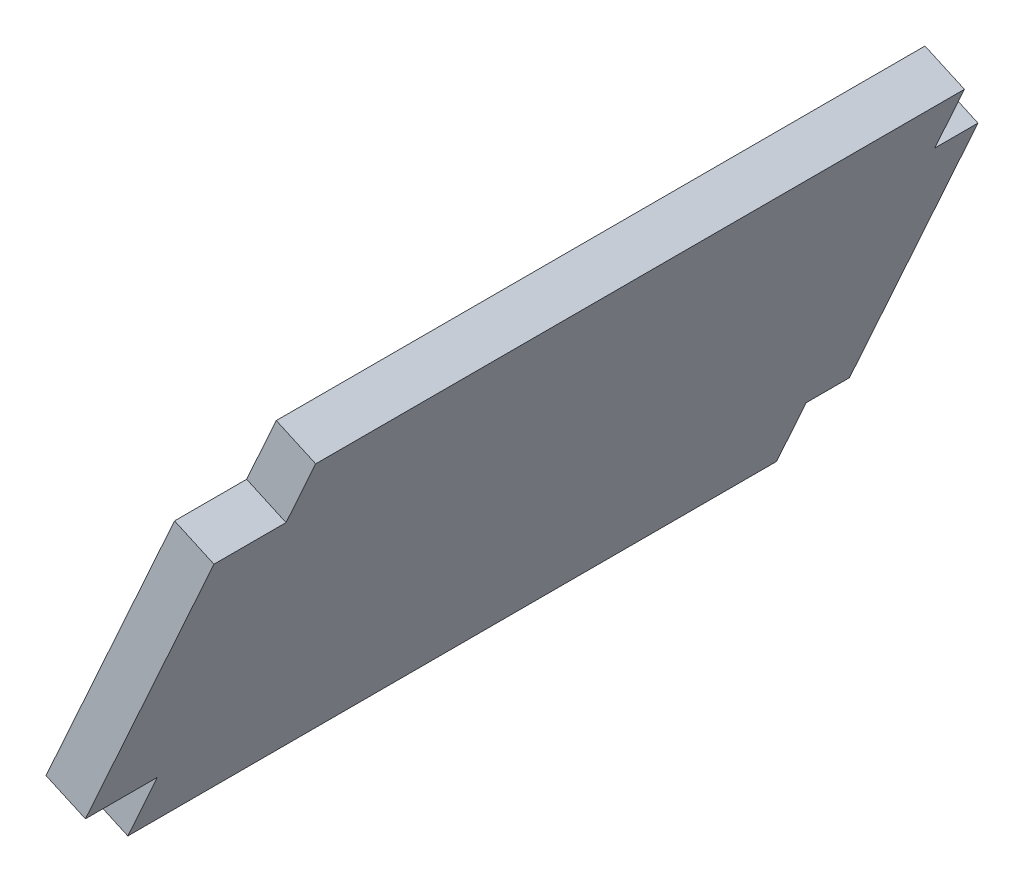
ISO-10303-21;
HEADER;
FILE_DESCRIPTION(('STEP AP214'),'2;1');
FILE_NAME('part.step','',(''),(''),'','','');
FILE_SCHEMA(('AUTOMOTIVE_DESIGN { 1 0 10303 214 1 1 1 1 }'));
ENDSEC;
DATA;
#1=APPLICATION_CONTEXT('core data for automotive mechanical design processes');
#2=APPLICATION_PROTOCOL_DEFINITION('international standard','automotive_design',2000,#1);
#3=PRODUCT_CONTEXT('',#1,'mechanical');
#4=PRODUCT('Part','Part','',(#3));
#5=PRODUCT_RELATED_PRODUCT_CATEGORY('part','',(#4));
#6=PRODUCT_DEFINITION_FORMATION('','',#4);
#7=PRODUCT_DEFINITION_CONTEXT('part definition',#1,'design');
#8=PRODUCT_DEFINITION('design','',#6,#7);
#9=PRODUCT_DEFINITION_SHAPE('','',#8);
#10=(LENGTH_UNIT() NAMED_UNIT(*) SI_UNIT(.MILLI.,.METRE.));
#11=(NAMED_UNIT(*) PLANE_ANGLE_UNIT() SI_UNIT($,.RADIAN.));
#12=(NAMED_UNIT(*) SI_UNIT($,.STERADIAN.) SOLID_ANGLE_UNIT());
#13=UNCERTAINTY_MEASURE_WITH_UNIT(LENGTH_MEASURE(1.E-05),#10,'distance_accuracy_value','');
#14=(GEOMETRIC_REPRESENTATION_CONTEXT(3) GLOBAL_UNCERTAINTY_ASSIGNED_CONTEXT((#13)) GLOBAL_UNIT_ASSIGNED_CONTEXT((#10,
#11,#12)) REPRESENTATION_CONTEXT('',''));
#15=CARTESIAN_POINT('',(0.,0.,0.));
#16=DIRECTION('',(0.,0.,1.));
#17=DIRECTION('',(1.,0.,0.));
#18=AXIS2_PLACEMENT_3D('',#15,#16,#17);
#19=CARTESIAN_POINT('',(210.601374281952,-57.1803626152906,-72.0098796299445));
#20=DIRECTION('',(0.411371375130518,0.911467822648296,0.));
#21=DIRECTION('',(-0.911467822648296,0.411371375130518,0.));
#22=AXIS2_PLACEMENT_3D('',#19,#20,#21);
#23=PLANE('',#22);
#24=DIRECTION('',(0.,0.,1.));
#25=VECTOR('',#24,1.);
#26=CARTESIAN_POINT('',(210.601374281952,-57.1803626152906,-72.0098796299445));
#27=LINE('',#26,#25);
#28=CARTESIAN_POINT('',(210.601374281952,-57.1803626152906,-48.));
#29=VERTEX_POINT('',#28);
#30=CARTESIAN_POINT('',(210.601374281951,-57.1803626152922,-45.));
#31=VERTEX_POINT('',#30);
#32=EDGE_CURVE('E185',#29,#31,#27,.T.);
#33=ORIENTED_EDGE('',*,*,#32,.F.);
#34=DIRECTION('',(0.911467822648296,-0.411371375130518,0.));
#35=VECTOR('',#34,1.);
#36=CARTESIAN_POINT('',(210.601374281952,-57.1803626152906,-48.));
#37=LINE('',#36,#35);
#38=CARTESIAN_POINT('',(213.335777749897,-58.4144767406822,-48.));
#39=VERTEX_POINT('',#38);
#40=EDGE_CURVE('E11',#29,#39,#37,.T.);
#41=ORIENTED_EDGE('',*,*,#40,.T.);
#42=DIRECTION('',(0.,0.,1.));
#43=VECTOR('',#42,1.);
#44=CARTESIAN_POINT('',(213.335777749897,-58.4144767406822,-72.0098796299445));
#45=LINE('',#44,#43);
#46=CARTESIAN_POINT('',(213.335777749896,-58.4144767406838,-45.));
#47=VERTEX_POINT('',#46);
#48=EDGE_CURVE('E187',#39,#47,#45,.T.);
#49=ORIENTED_EDGE('',*,*,#48,.T.);
#50=DIRECTION('',(0.911467822648296,-0.411371375130521,0.));
#51=VECTOR('',#50,1.);
#52=CARTESIAN_POINT('',(210.601374281951,-57.1803626152922,-45.));
#53=LINE('',#52,#51);
#54=EDGE_CURVE('E152',#31,#47,#53,.T.);
#55=ORIENTED_EDGE('',*,*,#54,.F.);
#56=EDGE_LOOP('',(#33,#41,#49,#55));
#57=FACE_BOUND('',#56,.T.);
#58=ADVANCED_FACE('F37',(#57),#23,.F.);
#59=CARTESIAN_POINT('',(222.253487982667,-38.6556738188879,-72.0098796299445));
#60=DIRECTION('',(-0.411371375130523,-0.911467822648295,0.));
#61=DIRECTION('',(0.911467822648295,-0.411371375130523,0.));
#62=AXIS2_PLACEMENT_3D('',#59,#60,#61);
#63=PLANE('',#62);
#64=DIRECTION('',(-0.911467822648292,0.411371375130528,0.));
#65=VECTOR('',#64,1.);
#66=CARTESIAN_POINT('',(219.519084514722,-37.4215596934964,0.));
#67=LINE('',#66,#65);
#68=CARTESIAN_POINT('',(222.253487982667,-38.6556738188879,0.));
#69=VERTEX_POINT('',#68);
#70=CARTESIAN_POINT('',(219.519084514722,-37.4215596934963,0.));
#71=VERTEX_POINT('',#70);
#72=EDGE_CURVE('E234',#69,#71,#67,.T.);
#73=ORIENTED_EDGE('',*,*,#72,.T.);
#74=DIRECTION('',(0.,0.,1.));
#75=VECTOR('',#74,1.);
#76=CARTESIAN_POINT('',(219.519084514722,-37.4215596934963,-72.0098796299445));
#77=LINE('',#76,#75);
#78=CARTESIAN_POINT('',(219.519084514722,-37.4215596934963,5.));
#79=VERTEX_POINT('',#78);
#80=EDGE_CURVE('E262',#71,#79,#77,.T.);
#81=ORIENTED_EDGE('',*,*,#80,.T.);
#82=DIRECTION('',(0.911467822648295,-0.411371375130523,0.));
#83=VECTOR('',#82,1.);
#84=CARTESIAN_POINT('',(222.253487982667,-38.6556738188879,5.));
#85=LINE('',#84,#83);
#86=CARTESIAN_POINT('',(222.253487982667,-38.6556738188879,5.));
#87=VERTEX_POINT('',#86);
#88=EDGE_CURVE('E221',#79,#87,#85,.T.);
#89=ORIENTED_EDGE('',*,*,#88,.T.);
#90=DIRECTION('',(0.,0.,1.));
#91=VECTOR('',#90,1.);
#92=CARTESIAN_POINT('',(222.253487982667,-38.6556738188879,-72.0098796299445));
#93=LINE('',#92,#91);
#94=EDGE_CURVE('E220',#69,#87,#93,.T.);
#95=ORIENTED_EDGE('',*,*,#94,.F.);
#96=EDGE_LOOP('',(#73,#81,#89,#95));
#97=FACE_BOUND('',#96,.T.);
#98=ADVANCED_FACE('F295',(#97),#63,.F.);
#99=DIRECTION('',(0.911467822648292,-0.411371375130528,0.));
#100=VECTOR('',#99,1.);
#101=CARTESIAN_POINT('',(219.519084514722,-37.4215596934964,-45.));
#102=LINE('',#101,#100);
#103=CARTESIAN_POINT('',(219.519084514722,-37.4215596934963,-45.));
#104=VERTEX_POINT('',#103);
#105=CARTESIAN_POINT('',(222.253487982667,-38.655673818888,-45.));
#106=VERTEX_POINT('',#105);
#107=EDGE_CURVE('E146',#104,#106,#102,.T.);
#108=ORIENTED_EDGE('',*,*,#107,.T.);
#109=CARTESIAN_POINT('',(222.253487982667,-38.6556738188879,-48.));
#110=VERTEX_POINT('',#109);
#111=EDGE_CURVE('E265',#110,#106,#93,.T.);
#112=ORIENTED_EDGE('',*,*,#111,.F.);
#113=DIRECTION('',(-0.911467822648295,0.411371375130523,0.));
#114=VECTOR('',#113,1.);
#115=CARTESIAN_POINT('',(222.253487982667,-38.6556738188879,-48.));
#116=LINE('',#115,#114);
#117=CARTESIAN_POINT('',(219.519084514722,-37.4215596934963,-48.));
#118=VERTEX_POINT('',#117);
#119=EDGE_CURVE('E210',#110,#118,#116,.T.);
#120=ORIENTED_EDGE('',*,*,#119,.T.);
#121=EDGE_CURVE('E193',#118,#104,#77,.T.);
#122=ORIENTED_EDGE('',*,*,#121,.T.);
#123=EDGE_LOOP('',(#108,#112,#120,#122));
#124=FACE_BOUND('',#123,.T.);
#125=ADVANCED_FACE('F271',(#124),#63,.F.);
#126=CARTESIAN_POINT('',(219.519084514722,-37.4215596934963,-72.0098796299445));
#127=DIRECTION('',(0.911467822648295,-0.411371375130521,0.));
#128=DIRECTION('',(0.411371375130521,0.911467822648295,0.));
#129=AXIS2_PLACEMENT_3D('',#126,#127,#128);
#130=PLANE('',#129);
#131=DIRECTION('',(-0.411371375130521,-0.911467822648295,0.));
#132=VECTOR('',#131,1.);
#133=CARTESIAN_POINT('',(219.519084514722,-37.4215596934963,-48.));
#134=LINE('',#133,#132);
#135=EDGE_CURVE('E46',#118,#29,#134,.T.);
#136=ORIENTED_EDGE('',*,*,#135,.T.);
#137=ORIENTED_EDGE('',*,*,#32,.T.);
#138=DIRECTION('',(0.411371375130526,0.911467822648293,0.));
#139=VECTOR('',#138,1.);
#140=CARTESIAN_POINT('',(208.544517406299,-61.7377017285337,-45.));
#141=LINE('',#140,#139);
#142=CARTESIAN_POINT('',(208.544517406299,-61.7377017285337,-45.));
#143=VERTEX_POINT('',#142);
#144=EDGE_CURVE('E151',#143,#31,#141,.T.);
#145=ORIENTED_EDGE('',*,*,#144,.F.);
#146=DIRECTION('',(0.,0.,-1.));
#147=VECTOR('',#146,1.);
#148=CARTESIAN_POINT('',(208.544517406299,-61.7377017285337,0.));
#149=LINE('',#148,#147);
#150=CARTESIAN_POINT('',(208.544517406299,-61.7377017285337,0.));
#151=VERTEX_POINT('',#150);
#152=EDGE_CURVE('E135',#151,#143,#149,.T.);
#153=ORIENTED_EDGE('',*,*,#152,.F.);
#154=DIRECTION('',(0.411371375130526,0.911467822648293,0.));
#155=VECTOR('',#154,1.);
#156=CARTESIAN_POINT('',(208.544517406299,-61.7377017285337,0.));
#157=LINE('',#156,#155);
#158=CARTESIAN_POINT('',(210.601374281952,-57.1803626152906,0.));
#159=VERTEX_POINT('',#158);
#160=EDGE_CURVE('E142',#151,#159,#157,.T.);
#161=ORIENTED_EDGE('',*,*,#160,.T.);
#162=CARTESIAN_POINT('',(210.601374281952,-57.1803626152906,5.));
#163=VERTEX_POINT('',#162);
#164=EDGE_CURVE('E190',#159,#163,#27,.T.);
#165=ORIENTED_EDGE('',*,*,#164,.T.);
#166=DIRECTION('',(0.411371375130521,0.911467822648295,0.));
#167=VECTOR('',#166,1.);
#168=CARTESIAN_POINT('',(219.519084514722,-37.4215596934963,5.));
#169=LINE('',#168,#167);
#170=EDGE_CURVE('E218',#163,#79,#169,.T.);
#171=ORIENTED_EDGE('',*,*,#170,.T.);
#172=ORIENTED_EDGE('',*,*,#80,.F.);
#173=DIRECTION('',(-0.411371375130523,-0.911467822648294,0.));
#174=VECTOR('',#173,1.);
#175=CARTESIAN_POINT('',(221.575941390375,-32.8642205802549,0.));
#176=LINE('',#175,#174);
#177=CARTESIAN_POINT('',(221.575941390375,-32.8642205802549,0.));
#178=VERTEX_POINT('',#177);
#179=EDGE_CURVE('E62',#178,#71,#176,.T.);
#180=ORIENTED_EDGE('',*,*,#179,.F.);
#181=DIRECTION('',(0.,0.,-1.));
#182=VECTOR('',#181,1.);
#183=CARTESIAN_POINT('',(221.575941390375,-32.8642205802549,0.));
#184=LINE('',#183,#182);
#185=CARTESIAN_POINT('',(221.575941390375,-32.8642205802549,-45.));
#186=VERTEX_POINT('',#185);
#187=EDGE_CURVE('E238',#178,#186,#184,.T.);
#188=ORIENTED_EDGE('',*,*,#187,.T.);
#189=DIRECTION('',(-0.411371375130523,-0.911467822648294,0.));
#190=VECTOR('',#189,1.);
#191=CARTESIAN_POINT('',(221.575941390375,-32.8642205802549,-45.));
#192=LINE('',#191,#190);
#193=EDGE_CURVE('E228',#186,#104,#192,.T.);
#194=ORIENTED_EDGE('',*,*,#193,.T.);
#195=ORIENTED_EDGE('',*,*,#121,.F.);
#196=EDGE_LOOP('',(#136,#137,#145,#153,#161,#165,#171,#172,#180,#188,#194,#195));
#197=FACE_BOUND('',#196,.T.);
#198=ADVANCED_FACE('F149',(#197),#130,.F.);
#199=CARTESIAN_POINT('',(213.335777749896,-58.4144767406838,0.));
#200=VERTEX_POINT('',#199);
#201=CARTESIAN_POINT('',(213.335777749897,-58.4144767406822,5.));
#202=VERTEX_POINT('',#201);
#203=EDGE_CURVE('E166',#200,#202,#45,.T.);
#204=ORIENTED_EDGE('',*,*,#203,.T.);
#205=DIRECTION('',(-0.911467822648297,0.411371375130519,0.));
#206=VECTOR('',#205,1.);
#207=CARTESIAN_POINT('',(210.601374281952,-57.1803626152906,5.));
#208=LINE('',#207,#206);
#209=EDGE_CURVE('E226',#202,#163,#208,.T.);
#210=ORIENTED_EDGE('',*,*,#209,.T.);
#211=ORIENTED_EDGE('',*,*,#164,.F.);
#212=DIRECTION('',(-0.911467822648295,0.411371375130521,0.));
#213=VECTOR('',#212,1.);
#214=CARTESIAN_POINT('',(210.601374281951,-57.1803626152922,0.));
#215=LINE('',#214,#213);
#216=EDGE_CURVE('E54',#200,#159,#215,.T.);
#217=ORIENTED_EDGE('',*,*,#216,.F.);
#218=EDGE_LOOP('',(#204,#210,#211,#217));
#219=FACE_BOUND('',#218,.T.);
#220=ADVANCED_FACE('F297',(#219),#23,.F.);
#221=CARTESIAN_POINT('',(213.335777749897,-58.4144767406822,-72.0098796299445));
#222=DIRECTION('',(-0.911467822648294,0.411371375130523,0.));
#223=DIRECTION('',(-0.411371375130523,-0.911467822648295,0.));
#224=AXIS2_PLACEMENT_3D('',#221,#222,#223);
#225=PLANE('',#224);
#226=DIRECTION('',(0.411371375130523,0.911467822648295,0.));
#227=VECTOR('',#226,1.);
#228=CARTESIAN_POINT('',(213.335777749897,-58.4144767406822,-48.));
#229=LINE('',#228,#227);
#230=EDGE_CURVE('E209',#39,#110,#229,.T.);
#231=ORIENTED_EDGE('',*,*,#230,.T.);
#232=ORIENTED_EDGE('',*,*,#111,.T.);
#233=DIRECTION('',(-0.411371375130523,-0.911467822648294,0.));
#234=VECTOR('',#233,1.);
#235=CARTESIAN_POINT('',(224.31034485832,-34.0983347056465,-45.));
#236=LINE('',#235,#234);
#237=CARTESIAN_POINT('',(224.31034485832,-34.0983347056465,-45.));
#238=VERTEX_POINT('',#237);
#239=EDGE_CURVE('E247',#238,#106,#236,.T.);
#240=ORIENTED_EDGE('',*,*,#239,.F.);
#241=DIRECTION('',(0.,0.,1.));
#242=VECTOR('',#241,1.);
#243=CARTESIAN_POINT('',(224.31034485832,-34.0983347056465,0.));
#244=LINE('',#243,#242);
#245=CARTESIAN_POINT('',(224.31034485832,-34.0983347056465,0.));
#246=VERTEX_POINT('',#245);
#247=EDGE_CURVE('E281',#238,#246,#244,.T.);
#248=ORIENTED_EDGE('',*,*,#247,.T.);
#249=DIRECTION('',(-0.411371375130523,-0.911467822648294,0.));
#250=VECTOR('',#249,1.);
#251=CARTESIAN_POINT('',(224.31034485832,-34.0983347056465,0.));
#252=LINE('',#251,#250);
#253=EDGE_CURVE('E243',#246,#69,#252,.T.);
#254=ORIENTED_EDGE('',*,*,#253,.T.);
#255=ORIENTED_EDGE('',*,*,#94,.T.);
#256=DIRECTION('',(-0.411371375130523,-0.911467822648294,0.));
#257=VECTOR('',#256,1.);
#258=CARTESIAN_POINT('',(213.335777749897,-58.4144767406822,5.));
#259=LINE('',#258,#257);
#260=EDGE_CURVE('E224',#87,#202,#259,.T.);
#261=ORIENTED_EDGE('',*,*,#260,.T.);
#262=ORIENTED_EDGE('',*,*,#203,.F.);
#263=DIRECTION('',(0.411371375130526,0.911467822648293,0.));
#264=VECTOR('',#263,1.);
#265=CARTESIAN_POINT('',(211.278920874244,-62.9718158539253,0.));
#266=LINE('',#265,#264);
#267=CARTESIAN_POINT('',(211.278920874244,-62.9718158539253,0.));
#268=VERTEX_POINT('',#267);
#269=EDGE_CURVE('E147',#268,#200,#266,.T.);
#270=ORIENTED_EDGE('',*,*,#269,.F.);
#271=DIRECTION('',(0.,0.,1.));
#272=VECTOR('',#271,1.);
#273=CARTESIAN_POINT('',(211.278920874244,-62.9718158539253,0.));
#274=LINE('',#273,#272);
#275=CARTESIAN_POINT('',(211.278920874244,-62.9718158539253,-45.));
#276=VERTEX_POINT('',#275);
#277=EDGE_CURVE('E138',#276,#268,#274,.T.);
#278=ORIENTED_EDGE('',*,*,#277,.F.);
#279=DIRECTION('',(0.411371375130526,0.911467822648293,0.));
#280=VECTOR('',#279,1.);
#281=CARTESIAN_POINT('',(211.278920874244,-62.9718158539253,-45.));
#282=LINE('',#281,#280);
#283=EDGE_CURVE('E173',#276,#47,#282,.T.);
#284=ORIENTED_EDGE('',*,*,#283,.T.);
#285=ORIENTED_EDGE('',*,*,#48,.F.);
#286=EDGE_LOOP('',(#231,#232,#240,#248,#254,#255,#261,#262,#270,#278,#284,#285));
#287=FACE_BOUND('',#286,.T.);
#288=ADVANCED_FACE('F269',(#287),#225,.F.);
#289=CARTESIAN_POINT('',(0.,0.,-48.));
#290=DIRECTION('',(0.,0.,-1.));
#291=DIRECTION('',(0.,-1.,0.));
#292=AXIS2_PLACEMENT_3D('',#289,#290,#291);
#293=PLANE('',#292);
#294=ORIENTED_EDGE('',*,*,#230,.F.);
#295=ORIENTED_EDGE('',*,*,#40,.F.);
#296=ORIENTED_EDGE('',*,*,#135,.F.);
#297=ORIENTED_EDGE('',*,*,#119,.F.);
#298=EDGE_LOOP('',(#294,#295,#296,#297));
#299=FACE_BOUND('',#298,.T.);
#300=ADVANCED_FACE('F39',(#299),#293,.T.);
#301=CARTESIAN_POINT('',(0.,0.,5.));
#302=DIRECTION('',(0.,0.,-1.));
#303=DIRECTION('',(0.,-1.,0.));
#304=AXIS2_PLACEMENT_3D('',#301,#302,#303);
#305=PLANE('',#304);
#306=ORIENTED_EDGE('',*,*,#88,.F.);
#307=ORIENTED_EDGE('',*,*,#170,.F.);
#308=ORIENTED_EDGE('',*,*,#209,.F.);
#309=ORIENTED_EDGE('',*,*,#260,.F.);
#310=EDGE_LOOP('',(#306,#307,#308,#309));
#311=FACE_BOUND('',#310,.T.);
#312=ADVANCED_FACE('F315',(#311),#305,.F.);
#313=CARTESIAN_POINT('',(221.575941390375,-32.8642205802549,-45.));
#314=DIRECTION('',(0.,0.,1.));
#315=DIRECTION('',(-1.,0.,0.));
#316=AXIS2_PLACEMENT_3D('',#313,#314,#315);
#317=PLANE('',#316);
#318=ORIENTED_EDGE('',*,*,#107,.F.);
#319=ORIENTED_EDGE('',*,*,#193,.F.);
#320=DIRECTION('',(0.911467822648292,-0.411371375130528,0.));
#321=VECTOR('',#320,1.);
#322=CARTESIAN_POINT('',(221.575941390375,-32.8642205802549,-45.));
#323=LINE('',#322,#321);
#324=EDGE_CURVE('E275',#186,#238,#323,.T.);
#325=ORIENTED_EDGE('',*,*,#324,.T.);
#326=ORIENTED_EDGE('',*,*,#239,.T.);
#327=EDGE_LOOP('',(#318,#319,#325,#326));
#328=FACE_BOUND('',#327,.T.);
#329=ADVANCED_FACE('F273',(#328),#317,.F.);
#330=CARTESIAN_POINT('',(221.575941390375,-32.8642205802549,0.));
#331=DIRECTION('',(0.,0.,-1.));
#332=DIRECTION('',(1.,0.,0.));
#333=AXIS2_PLACEMENT_3D('',#330,#331,#332);
#334=PLANE('',#333);
#335=ORIENTED_EDGE('',*,*,#72,.F.);
#336=ORIENTED_EDGE('',*,*,#253,.F.);
#337=DIRECTION('',(-0.911467822648292,0.411371375130528,0.));
#338=VECTOR('',#337,1.);
#339=CARTESIAN_POINT('',(221.575941390375,-32.8642205802549,0.));
#340=LINE('',#339,#338);
#341=EDGE_CURVE('E244',#246,#178,#340,.T.);
#342=ORIENTED_EDGE('',*,*,#341,.T.);
#343=ORIENTED_EDGE('',*,*,#179,.T.);
#344=EDGE_LOOP('',(#335,#336,#342,#343));
#345=FACE_BOUND('',#344,.T.);
#346=ADVANCED_FACE('F284',(#345),#334,.F.);
#347=CARTESIAN_POINT('',(25.1740029935469,55.7775651954132,0.));
#348=DIRECTION('',(0.411371375130529,0.911467822648292,0.));
#349=DIRECTION('',(-0.911467822648292,0.411371375130529,0.));
#350=AXIS2_PLACEMENT_3D('',#347,#348,#349);
#351=PLANE('',#350);
#352=ORIENTED_EDGE('',*,*,#187,.F.);
#353=ORIENTED_EDGE('',*,*,#341,.F.);
#354=ORIENTED_EDGE('',*,*,#247,.F.);
#355=ORIENTED_EDGE('',*,*,#324,.F.);
#356=EDGE_LOOP('',(#352,#353,#354,#355));
#357=FACE_BOUND('',#356,.T.);
#358=ADVANCED_FACE('F285',(#357),#351,.T.);
#359=CARTESIAN_POINT('',(208.544517406299,-61.7377017285337,0.));
#360=DIRECTION('',(0.,0.,1.));
#361=DIRECTION('',(-1.,0.,0.));
#362=AXIS2_PLACEMENT_3D('',#359,#360,#361);
#363=PLANE('',#362);
#364=ORIENTED_EDGE('',*,*,#216,.T.);
#365=ORIENTED_EDGE('',*,*,#160,.F.);
#366=DIRECTION('',(-0.911467822648295,0.411371375130521,0.));
#367=VECTOR('',#366,1.);
#368=CARTESIAN_POINT('',(208.544517406299,-61.7377017285337,0.));
#369=LINE('',#368,#367);
#370=EDGE_CURVE('E132',#268,#151,#369,.T.);
#371=ORIENTED_EDGE('',*,*,#370,.F.);
#372=ORIENTED_EDGE('',*,*,#269,.T.);
#373=EDGE_LOOP('',(#364,#365,#371,#372));
#374=FACE_BOUND('',#373,.T.);
#375=ADVANCED_FACE('F143',(#374),#363,.T.);
#376=CARTESIAN_POINT('',(208.544517406299,-61.7377017285337,-45.));
#377=DIRECTION('',(0.,0.,-1.));
#378=DIRECTION('',(1.,0.,0.));
#379=AXIS2_PLACEMENT_3D('',#376,#377,#378);
#380=PLANE('',#379);
#381=ORIENTED_EDGE('',*,*,#54,.T.);
#382=ORIENTED_EDGE('',*,*,#283,.F.);
#383=DIRECTION('',(0.911467822648296,-0.411371375130521,0.));
#384=VECTOR('',#383,1.);
#385=CARTESIAN_POINT('',(208.544517406299,-61.7377017285337,-45.));
#386=LINE('',#385,#384);
#387=EDGE_CURVE('E158',#143,#276,#386,.T.);
#388=ORIENTED_EDGE('',*,*,#387,.F.);
#389=ORIENTED_EDGE('',*,*,#144,.T.);
#390=EDGE_LOOP('',(#381,#382,#388,#389));
#391=FACE_BOUND('',#390,.T.);
#392=ADVANCED_FACE('F180',(#391),#380,.T.);
#393=CARTESIAN_POINT('',(12.1425790094699,26.9040840471326,0.));
#394=DIRECTION('',(-0.411371375130521,-0.911467822648296,0.));
#395=DIRECTION('',(-0.911467822648296,0.411371375130521,0.));
#396=AXIS2_PLACEMENT_3D('',#393,#394,#395);
#397=PLANE('',#396);
#398=ORIENTED_EDGE('',*,*,#152,.T.);
#399=ORIENTED_EDGE('',*,*,#387,.T.);
#400=ORIENTED_EDGE('',*,*,#277,.T.);
#401=ORIENTED_EDGE('',*,*,#370,.T.);
#402=EDGE_LOOP('',(#398,#399,#400,#401));
#403=FACE_BOUND('',#402,.T.);
#404=ADVANCED_FACE('F133',(#403),#397,.T.);
#405=CLOSED_SHELL('',(#58,#98,#125,#198,#220,#288,#300,#312,#329,#346,#358,#375,#392,#404));
#406=MANIFOLD_SOLID_BREP('B2',#405);
#407=ADVANCED_BREP_SHAPE_REPRESENTATION('',(#18,#406),#14);
#408=SHAPE_DEFINITION_REPRESENTATION(#9,#407);
ENDSEC;
END-ISO-10303-21;
